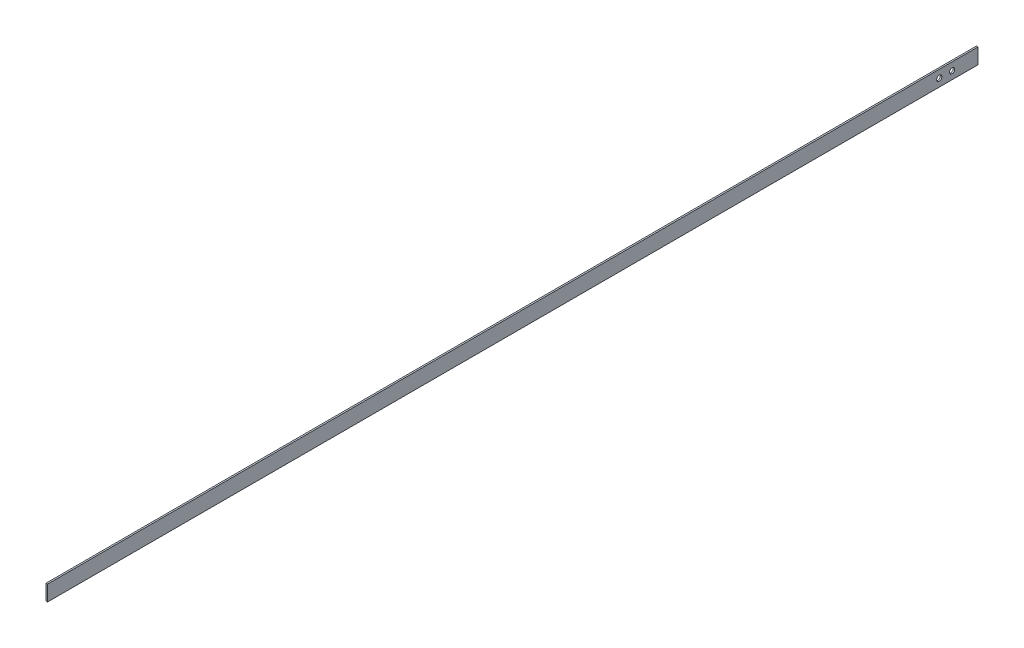
ISO-10303-21;
HEADER;
FILE_DESCRIPTION(('STEP AP214'),'2;1');
FILE_NAME('part.step','',(''),(''),'','','');
FILE_SCHEMA(('AUTOMOTIVE_DESIGN { 1 0 10303 214 1 1 1 1 }'));
ENDSEC;
DATA;
#1=APPLICATION_CONTEXT('core data for automotive mechanical design processes');
#2=APPLICATION_PROTOCOL_DEFINITION('international standard','automotive_design',2000,#1);
#3=PRODUCT_CONTEXT('',#1,'mechanical');
#4=PRODUCT('Part','Part','',(#3));
#5=PRODUCT_RELATED_PRODUCT_CATEGORY('part','',(#4));
#6=PRODUCT_DEFINITION_FORMATION('','',#4);
#7=PRODUCT_DEFINITION_CONTEXT('part definition',#1,'design');
#8=PRODUCT_DEFINITION('design','',#6,#7);
#9=PRODUCT_DEFINITION_SHAPE('','',#8);
#10=(LENGTH_UNIT() NAMED_UNIT(*) SI_UNIT(.MILLI.,.METRE.));
#11=(NAMED_UNIT(*) PLANE_ANGLE_UNIT() SI_UNIT($,.RADIAN.));
#12=(NAMED_UNIT(*) SI_UNIT($,.STERADIAN.) SOLID_ANGLE_UNIT());
#13=UNCERTAINTY_MEASURE_WITH_UNIT(LENGTH_MEASURE(1.E-05),#10,'distance_accuracy_value','');
#14=(GEOMETRIC_REPRESENTATION_CONTEXT(3) GLOBAL_UNCERTAINTY_ASSIGNED_CONTEXT((#13)) GLOBAL_UNIT_ASSIGNED_CONTEXT((#10,
#11,#12)) REPRESENTATION_CONTEXT('',''));
#15=CARTESIAN_POINT('',(0.,0.,0.));
#16=DIRECTION('',(0.,0.,1.));
#17=DIRECTION('',(1.,0.,0.));
#18=AXIS2_PLACEMENT_3D('',#15,#16,#17);
#19=CARTESIAN_POINT('',(0.15,-1.5,180.));
#20=DIRECTION('',(-1.,0.,0.));
#21=DIRECTION('',(0.,0.,1.));
#22=AXIS2_PLACEMENT_3D('',#19,#20,#21);
#23=PLANE('',#22);
#24=CARTESIAN_POINT('',(0.150000000000001,0.,7.5));
#25=DIRECTION('',(1.,0.,0.));
#26=DIRECTION('',(0.,0.,-1.));
#27=AXIS2_PLACEMENT_3D('',#24,#25,#26);
#28=CIRCLE('',#27,0.499999999999988);
#29=CARTESIAN_POINT('',(0.150000000000001,0.,7.00000000000001));
#30=VERTEX_POINT('',#29);
#31=EDGE_CURVE('E121',#30,#30,#28,.T.);
#32=ORIENTED_EDGE('',*,*,#31,.F.);
#33=EDGE_LOOP('',(#32));
#34=FACE_BOUND('',#33,.T.);
#35=CARTESIAN_POINT('',(0.150000000000001,0.,5.));
#36=DIRECTION('',(1.,0.,0.));
#37=DIRECTION('',(0.,0.,-1.));
#38=AXIS2_PLACEMENT_3D('',#35,#36,#37);
#39=CIRCLE('',#38,0.499999999999988);
#40=CARTESIAN_POINT('',(0.150000000000001,0.,4.50000000000001));
#41=VERTEX_POINT('',#40);
#42=EDGE_CURVE('E115',#41,#41,#39,.T.);
#43=ORIENTED_EDGE('',*,*,#42,.F.);
#44=EDGE_LOOP('',(#43));
#45=FACE_BOUND('',#44,.T.);
#46=DIRECTION('',(0.,1.,0.));
#47=VECTOR('',#46,1.);
#48=CARTESIAN_POINT('',(0.15,-1.5,0.));
#49=LINE('',#48,#47);
#50=CARTESIAN_POINT('',(0.15,-1.5,0.));
#51=VERTEX_POINT('',#50);
#52=CARTESIAN_POINT('',(0.15,1.5,0.));
#53=VERTEX_POINT('',#52);
#54=EDGE_CURVE('E99',#51,#53,#49,.T.);
#55=ORIENTED_EDGE('',*,*,#54,.T.);
#56=DIRECTION('',(0.,0.,-1.));
#57=VECTOR('',#56,1.);
#58=CARTESIAN_POINT('',(0.15,1.5,180.));
#59=LINE('',#58,#57);
#60=CARTESIAN_POINT('',(0.15,1.5,180.));
#61=VERTEX_POINT('',#60);
#62=EDGE_CURVE('E11',#61,#53,#59,.T.);
#63=ORIENTED_EDGE('',*,*,#62,.F.);
#64=DIRECTION('',(0.,1.,0.));
#65=VECTOR('',#64,1.);
#66=CARTESIAN_POINT('',(0.15,-1.5,180.));
#67=LINE('',#66,#65);
#68=CARTESIAN_POINT('',(0.15,-1.5,180.));
#69=VERTEX_POINT('',#68);
#70=EDGE_CURVE('E87',#69,#61,#67,.T.);
#71=ORIENTED_EDGE('',*,*,#70,.F.);
#72=DIRECTION('',(0.,0.,-1.));
#73=VECTOR('',#72,1.);
#74=CARTESIAN_POINT('',(0.15,-1.5,180.));
#75=LINE('',#74,#73);
#76=EDGE_CURVE('E95',#69,#51,#75,.T.);
#77=ORIENTED_EDGE('',*,*,#76,.T.);
#78=EDGE_LOOP('',(#55,#63,#71,#77));
#79=FACE_BOUND('',#78,.T.);
#80=ADVANCED_FACE('F36',(#34,#45,#79),#23,.F.);
#81=CARTESIAN_POINT('',(-0.15,1.5,180.));
#82=DIRECTION('',(0.,-1.,0.));
#83=DIRECTION('',(0.,0.,-1.));
#84=AXIS2_PLACEMENT_3D('',#81,#82,#83);
#85=PLANE('',#84);
#86=DIRECTION('',(-1.,0.,0.));
#87=VECTOR('',#86,1.);
#88=CARTESIAN_POINT('',(-0.15,1.5,0.));
#89=LINE('',#88,#87);
#90=CARTESIAN_POINT('',(-0.15,1.5,0.));
#91=VERTEX_POINT('',#90);
#92=EDGE_CURVE('E91',#53,#91,#89,.T.);
#93=ORIENTED_EDGE('',*,*,#92,.T.);
#94=DIRECTION('',(0.,0.,-1.));
#95=VECTOR('',#94,1.);
#96=CARTESIAN_POINT('',(-0.15,1.5,180.));
#97=LINE('',#96,#95);
#98=CARTESIAN_POINT('',(-0.15,1.5,180.));
#99=VERTEX_POINT('',#98);
#100=EDGE_CURVE('E44',#99,#91,#97,.T.);
#101=ORIENTED_EDGE('',*,*,#100,.F.);
#102=DIRECTION('',(-1.,0.,0.));
#103=VECTOR('',#102,1.);
#104=CARTESIAN_POINT('',(-0.15,1.5,180.));
#105=LINE('',#104,#103);
#106=EDGE_CURVE('E82',#61,#99,#105,.T.);
#107=ORIENTED_EDGE('',*,*,#106,.F.);
#108=ORIENTED_EDGE('',*,*,#62,.T.);
#109=EDGE_LOOP('',(#93,#101,#107,#108));
#110=FACE_BOUND('',#109,.T.);
#111=ADVANCED_FACE('F90',(#110),#85,.F.);
#112=CARTESIAN_POINT('',(-0.15,-1.5,180.));
#113=DIRECTION('',(1.,0.,0.));
#114=DIRECTION('',(0.,0.,-1.));
#115=AXIS2_PLACEMENT_3D('',#112,#113,#114);
#116=PLANE('',#115);
#117=CARTESIAN_POINT('',(-0.15,0.,7.5));
#118=DIRECTION('',(1.,0.,0.));
#119=DIRECTION('',(0.,0.,-1.));
#120=AXIS2_PLACEMENT_3D('',#117,#118,#119);
#121=CIRCLE('',#120,0.499999999999999);
#122=CARTESIAN_POINT('',(-0.15,0.,7.));
#123=VERTEX_POINT('',#122);
#124=EDGE_CURVE('E118',#123,#123,#121,.T.);
#125=ORIENTED_EDGE('',*,*,#124,.T.);
#126=EDGE_LOOP('',(#125));
#127=FACE_BOUND('',#126,.T.);
#128=CARTESIAN_POINT('',(-0.15,0.,5.));
#129=DIRECTION('',(1.,0.,0.));
#130=DIRECTION('',(0.,0.,-1.));
#131=AXIS2_PLACEMENT_3D('',#128,#129,#130);
#132=CIRCLE('',#131,0.499999999999999);
#133=CARTESIAN_POINT('',(-0.15,0.,4.5));
#134=VERTEX_POINT('',#133);
#135=EDGE_CURVE('E102',#134,#134,#132,.T.);
#136=ORIENTED_EDGE('',*,*,#135,.T.);
#137=EDGE_LOOP('',(#136));
#138=FACE_BOUND('',#137,.T.);
#139=DIRECTION('',(0.,-1.,0.));
#140=VECTOR('',#139,1.);
#141=CARTESIAN_POINT('',(-0.15,-1.5,0.));
#142=LINE('',#141,#140);
#143=CARTESIAN_POINT('',(-0.15,-1.5,0.));
#144=VERTEX_POINT('',#143);
#145=EDGE_CURVE('E69',#91,#144,#142,.T.);
#146=ORIENTED_EDGE('',*,*,#145,.T.);
#147=DIRECTION('',(0.,0.,-1.));
#148=VECTOR('',#147,1.);
#149=CARTESIAN_POINT('',(-0.15,-1.5,180.));
#150=LINE('',#149,#148);
#151=CARTESIAN_POINT('',(-0.15,-1.5,180.));
#152=VERTEX_POINT('',#151);
#153=EDGE_CURVE('E92',#152,#144,#150,.T.);
#154=ORIENTED_EDGE('',*,*,#153,.F.);
#155=DIRECTION('',(0.,-1.,0.));
#156=VECTOR('',#155,1.);
#157=CARTESIAN_POINT('',(-0.15,-1.5,180.));
#158=LINE('',#157,#156);
#159=EDGE_CURVE('E85',#99,#152,#158,.T.);
#160=ORIENTED_EDGE('',*,*,#159,.F.);
#161=ORIENTED_EDGE('',*,*,#100,.T.);
#162=EDGE_LOOP('',(#146,#154,#160,#161));
#163=FACE_BOUND('',#162,.T.);
#164=ADVANCED_FACE('F93',(#127,#138,#163),#116,.F.);
#165=CARTESIAN_POINT('',(-0.15,-1.5,180.));
#166=DIRECTION('',(0.,1.,0.));
#167=DIRECTION('',(0.,0.,1.));
#168=AXIS2_PLACEMENT_3D('',#165,#166,#167);
#169=PLANE('',#168);
#170=DIRECTION('',(1.,0.,0.));
#171=VECTOR('',#170,1.);
#172=CARTESIAN_POINT('',(-0.15,-1.5,0.));
#173=LINE('',#172,#171);
#174=EDGE_CURVE('E75',#144,#51,#173,.T.);
#175=ORIENTED_EDGE('',*,*,#174,.T.);
#176=ORIENTED_EDGE('',*,*,#76,.F.);
#177=DIRECTION('',(1.,0.,0.));
#178=VECTOR('',#177,1.);
#179=CARTESIAN_POINT('',(-0.15,-1.5,180.));
#180=LINE('',#179,#178);
#181=EDGE_CURVE('E52',#152,#69,#180,.T.);
#182=ORIENTED_EDGE('',*,*,#181,.F.);
#183=ORIENTED_EDGE('',*,*,#153,.T.);
#184=EDGE_LOOP('',(#175,#176,#182,#183));
#185=FACE_BOUND('',#184,.T.);
#186=ADVANCED_FACE('F107',(#185),#169,.F.);
#187=CARTESIAN_POINT('',(0.,0.,180.));
#188=DIRECTION('',(0.,0.,-1.));
#189=DIRECTION('',(-1.,0.,0.));
#190=AXIS2_PLACEMENT_3D('',#187,#188,#189);
#191=PLANE('',#190);
#192=ORIENTED_EDGE('',*,*,#70,.T.);
#193=ORIENTED_EDGE('',*,*,#106,.T.);
#194=ORIENTED_EDGE('',*,*,#159,.T.);
#195=ORIENTED_EDGE('',*,*,#181,.T.);
#196=EDGE_LOOP('',(#192,#193,#194,#195));
#197=FACE_BOUND('',#196,.T.);
#198=ADVANCED_FACE('F83',(#197),#191,.F.);
#199=CARTESIAN_POINT('',(0.,0.,0.));
#200=DIRECTION('',(0.,0.,-1.));
#201=DIRECTION('',(-1.,0.,0.));
#202=AXIS2_PLACEMENT_3D('',#199,#200,#201);
#203=PLANE('',#202);
#204=ORIENTED_EDGE('',*,*,#54,.F.);
#205=ORIENTED_EDGE('',*,*,#174,.F.);
#206=ORIENTED_EDGE('',*,*,#145,.F.);
#207=ORIENTED_EDGE('',*,*,#92,.F.);
#208=EDGE_LOOP('',(#204,#205,#206,#207));
#209=FACE_BOUND('',#208,.T.);
#210=ADVANCED_FACE('F110',(#209),#203,.T.);
#211=CARTESIAN_POINT('',(0.15,0.,5.));
#212=DIRECTION('',(1.,0.,0.));
#213=DIRECTION('',(0.,0.,-1.));
#214=AXIS2_PLACEMENT_3D('',#211,#212,#213);
#215=CYLINDRICAL_SURFACE('',#214,0.499999999999994);
#216=ORIENTED_EDGE('',*,*,#135,.F.);
#217=EDGE_LOOP('',(#216));
#218=FACE_BOUND('',#217,.T.);
#219=ORIENTED_EDGE('',*,*,#42,.T.);
#220=EDGE_LOOP('',(#219));
#221=FACE_BOUND('',#220,.T.);
#222=ADVANCED_FACE('F131',(#218,#221),#215,.F.);
#223=CARTESIAN_POINT('',(0.15,0.,7.5));
#224=DIRECTION('',(1.,0.,0.));
#225=DIRECTION('',(0.,0.,-1.));
#226=AXIS2_PLACEMENT_3D('',#223,#224,#225);
#227=CYLINDRICAL_SURFACE('',#226,0.499999999999994);
#228=ORIENTED_EDGE('',*,*,#124,.F.);
#229=EDGE_LOOP('',(#228));
#230=FACE_BOUND('',#229,.T.);
#231=ORIENTED_EDGE('',*,*,#31,.T.);
#232=EDGE_LOOP('',(#231));
#233=FACE_BOUND('',#232,.T.);
#234=ADVANCED_FACE('F125',(#230,#233),#227,.F.);
#235=CLOSED_SHELL('',(#80,#111,#164,#186,#198,#210,#222,#234));
#236=MANIFOLD_SOLID_BREP('B2',#235);
#237=ADVANCED_BREP_SHAPE_REPRESENTATION('',(#18,#236),#14);
#238=SHAPE_DEFINITION_REPRESENTATION(#9,#237);
ENDSEC;
END-ISO-10303-21;
